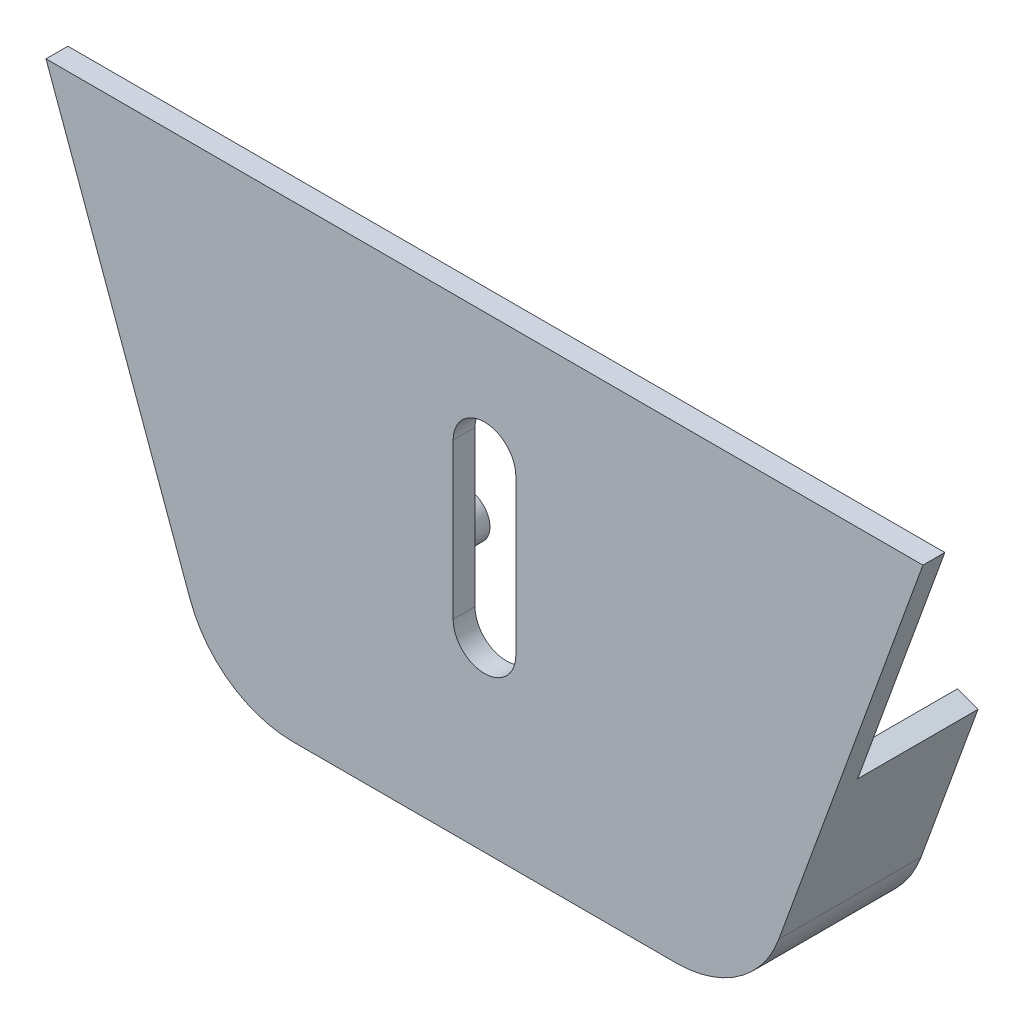
ISO-10303-21;
HEADER;
FILE_DESCRIPTION(('STEP AP214'),'2;1');
FILE_NAME('part.step','',(''),(''),'','','');
FILE_SCHEMA(('AUTOMOTIVE_DESIGN { 1 0 10303 214 1 1 1 1 }'));
ENDSEC;
DATA;
#1=APPLICATION_CONTEXT('core data for automotive mechanical design processes');
#2=APPLICATION_PROTOCOL_DEFINITION('international standard','automotive_design',2000,#1);
#3=PRODUCT_CONTEXT('',#1,'mechanical');
#4=PRODUCT('Part','Part','',(#3));
#5=PRODUCT_RELATED_PRODUCT_CATEGORY('part','',(#4));
#6=PRODUCT_DEFINITION_FORMATION('','',#4);
#7=PRODUCT_DEFINITION_CONTEXT('part definition',#1,'design');
#8=PRODUCT_DEFINITION('design','',#6,#7);
#9=PRODUCT_DEFINITION_SHAPE('','',#8);
#10=(LENGTH_UNIT() NAMED_UNIT(*) SI_UNIT(.MILLI.,.METRE.));
#11=(NAMED_UNIT(*) PLANE_ANGLE_UNIT() SI_UNIT($,.RADIAN.));
#12=(NAMED_UNIT(*) SI_UNIT($,.STERADIAN.) SOLID_ANGLE_UNIT());
#13=UNCERTAINTY_MEASURE_WITH_UNIT(LENGTH_MEASURE(1.E-05),#10,'distance_accuracy_value','');
#14=(GEOMETRIC_REPRESENTATION_CONTEXT(3) GLOBAL_UNCERTAINTY_ASSIGNED_CONTEXT((#13)) GLOBAL_UNIT_ASSIGNED_CONTEXT((#10,
#11,#12)) REPRESENTATION_CONTEXT('',''));
#15=CARTESIAN_POINT('',(0.,0.,0.));
#16=DIRECTION('',(0.,0.,1.));
#17=DIRECTION('',(1.,0.,0.));
#18=AXIS2_PLACEMENT_3D('',#15,#16,#17);
#19=CARTESIAN_POINT('',(-17.5,0.,0.));
#20=DIRECTION('',(0.,0.,1.));
#21=DIRECTION('',(1.,0.,0.));
#22=AXIS2_PLACEMENT_3D('',#19,#20,#21);
#23=PLANE('',#22);
#24=CARTESIAN_POINT('',(17.5,0.,0.));
#25=DIRECTION('',(0.,0.,1.));
#26=DIRECTION('',(1.,0.,0.));
#27=AXIS2_PLACEMENT_3D('',#24,#25,#26);
#28=CIRCLE('',#27,3.5);
#29=CARTESIAN_POINT('',(21.,0.,0.));
#30=VERTEX_POINT('',#29);
#31=EDGE_CURVE('E347',#30,#30,#28,.T.);
#32=ORIENTED_EDGE('',*,*,#31,.T.);
#33=EDGE_LOOP('',(#32));
#34=FACE_BOUND('',#33,.T.);
#35=CARTESIAN_POINT('',(-17.5,0.,0.));
#36=DIRECTION('',(0.,0.,1.));
#37=DIRECTION('',(1.,0.,0.));
#38=AXIS2_PLACEMENT_3D('',#35,#36,#37);
#39=CIRCLE('',#38,3.5);
#40=CARTESIAN_POINT('',(-14.,0.,0.));
#41=VERTEX_POINT('',#40);
#42=EDGE_CURVE('E351',#41,#41,#39,.T.);
#43=ORIENTED_EDGE('',*,*,#42,.T.);
#44=EDGE_LOOP('',(#43));
#45=FACE_BOUND('',#44,.T.);
#46=CARTESIAN_POINT('',(0.,21.1909496420136,0.));
#47=DIRECTION('',(0.,0.,1.));
#48=DIRECTION('',(1.,0.,0.));
#49=AXIS2_PLACEMENT_3D('',#46,#47,#48);
#50=CIRCLE('',#49,2.86348055453857);
#51=CARTESIAN_POINT('',(2.86348055453857,21.1909496420136,0.));
#52=VERTEX_POINT('',#51);
#53=CARTESIAN_POINT('',(-2.86348055453857,21.1909496420136,0.));
#54=VERTEX_POINT('',#53);
#55=EDGE_CURVE('E359',#52,#54,#50,.T.);
#56=ORIENTED_EDGE('',*,*,#55,.T.);
#57=DIRECTION('',(0.,-1.,0.));
#58=VECTOR('',#57,1.);
#59=CARTESIAN_POINT('',(-2.86348055453857,21.1909496420136,0.));
#60=LINE('',#59,#58);
#61=CARTESIAN_POINT('',(-2.86348055453857,7.01437378183931,0.));
#62=VERTEX_POINT('',#61);
#63=EDGE_CURVE('E380',#54,#62,#60,.T.);
#64=ORIENTED_EDGE('',*,*,#63,.T.);
#65=CARTESIAN_POINT('',(0.,7.01437378183931,0.));
#66=DIRECTION('',(0.,0.,1.));
#67=DIRECTION('',(1.,0.,0.));
#68=AXIS2_PLACEMENT_3D('',#65,#66,#67);
#69=CIRCLE('',#68,2.86348055453857);
#70=CARTESIAN_POINT('',(2.86348055453857,7.01437378183931,0.));
#71=VERTEX_POINT('',#70);
#72=EDGE_CURVE('E384',#62,#71,#69,.T.);
#73=ORIENTED_EDGE('',*,*,#72,.T.);
#74=DIRECTION('',(0.,1.,0.));
#75=VECTOR('',#74,1.);
#76=CARTESIAN_POINT('',(2.86348055453857,21.1909496420136,0.));
#77=LINE('',#76,#75);
#78=EDGE_CURVE('E367',#71,#52,#77,.T.);
#79=ORIENTED_EDGE('',*,*,#78,.T.);
#80=EDGE_LOOP('',(#56,#64,#73,#79));
#81=FACE_BOUND('',#80,.T.);
#82=DIRECTION('',(0.939692620785908,0.34202014332567,0.));
#83=VECTOR('',#82,1.);
#84=CARTESIAN_POINT('',(-30.2164350704281,11.5476830106572,0.));
#85=LINE('',#84,#83);
#86=CARTESIAN_POINT('',(-32.0958203119999,10.8636427240058,0.));
#87=VERTEX_POINT('',#86);
#88=CARTESIAN_POINT('',(-30.2164350704281,11.5476830106572,0.));
#89=VERTEX_POINT('',#88);
#90=EDGE_CURVE('E322',#87,#89,#85,.T.);
#91=ORIENTED_EDGE('',*,*,#90,.F.);
#92=DIRECTION('',(0.342020143325671,-0.939692620785908,0.));
#93=VECTOR('',#92,1.);
#94=CARTESIAN_POINT('',(-26.8969262078591,-3.42020143325671,0.));
#95=LINE('',#94,#93);
#96=CARTESIAN_POINT('',(-40.0654484737313,32.7600161398124,0.));
#97=VERTEX_POINT('',#96);
#98=EDGE_CURVE('E229',#97,#87,#95,.T.);
#99=ORIENTED_EDGE('',*,*,#98,.F.);
#100=DIRECTION('',(-1.,0.,0.));
#101=VECTOR('',#100,1.);
#102=CARTESIAN_POINT('',(-40.0654484737313,32.7600161398124,0.));
#103=LINE('',#102,#101);
#104=CARTESIAN_POINT('',(40.0654484737315,32.7600161398124,0.));
#105=VERTEX_POINT('',#104);
#106=EDGE_CURVE('E233',#105,#97,#103,.T.);
#107=ORIENTED_EDGE('',*,*,#106,.F.);
#108=DIRECTION('',(0.342020143325674,0.939692620785906,0.));
#109=VECTOR('',#108,1.);
#110=CARTESIAN_POINT('',(40.0654484737315,32.7600161398124,0.));
#111=LINE('',#110,#109);
#112=CARTESIAN_POINT('',(32.0958203119999,10.8636427240058,0.));
#113=VERTEX_POINT('',#112);
#114=EDGE_CURVE('E211',#113,#105,#111,.T.);
#115=ORIENTED_EDGE('',*,*,#114,.F.);
#116=DIRECTION('',(0.939692620785905,-0.342020143325677,0.));
#117=VECTOR('',#116,1.);
#118=CARTESIAN_POINT('',(32.0958203119999,10.8636427240058,0.));
#119=LINE('',#118,#117);
#120=CARTESIAN_POINT('',(30.2164350704281,11.5476830106572,0.));
#121=VERTEX_POINT('',#120);
#122=EDGE_CURVE('E303',#121,#113,#119,.T.);
#123=ORIENTED_EDGE('',*,*,#122,.F.);
#124=DIRECTION('',(0.342020143325674,0.939692620785907,0.));
#125=VECTOR('',#124,1.);
#126=CARTESIAN_POINT('',(25.0175409662873,-2.73616114660539,0.));
#127=LINE('',#126,#125);
#128=CARTESIAN_POINT('',(25.0175409662873,-2.73616114660539,0.));
#129=VERTEX_POINT('',#128);
#130=EDGE_CURVE('E325',#129,#121,#127,.T.);
#131=ORIENTED_EDGE('',*,*,#130,.F.);
#132=CARTESIAN_POINT('',(17.5,0.,0.));
#133=DIRECTION('',(0.,0.,1.));
#134=DIRECTION('',(-1.,0.,0.));
#135=AXIS2_PLACEMENT_3D('',#132,#133,#134);
#136=CIRCLE('',#135,8.);
#137=CARTESIAN_POINT('',(17.5,-8.,0.));
#138=VERTEX_POINT('',#137);
#139=EDGE_CURVE('E321',#138,#129,#136,.T.);
#140=ORIENTED_EDGE('',*,*,#139,.F.);
#141=DIRECTION('',(0.,1.,0.));
#142=VECTOR('',#141,1.);
#143=CARTESIAN_POINT('',(17.5,-10.,0.));
#144=LINE('',#143,#142);
#145=CARTESIAN_POINT('',(17.5,-10.,0.));
#146=VERTEX_POINT('',#145);
#147=EDGE_CURVE('E206',#146,#138,#144,.T.);
#148=ORIENTED_EDGE('',*,*,#147,.F.);
#149=DIRECTION('',(1.,0.,0.));
#150=VECTOR('',#149,1.);
#151=CARTESIAN_POINT('',(-17.5,-10.,0.));
#152=LINE('',#151,#150);
#153=CARTESIAN_POINT('',(-17.5,-10.,0.));
#154=VERTEX_POINT('',#153);
#155=EDGE_CURVE('E203',#154,#146,#152,.T.);
#156=ORIENTED_EDGE('',*,*,#155,.F.);
#157=DIRECTION('',(0.,-1.,0.));
#158=VECTOR('',#157,1.);
#159=CARTESIAN_POINT('',(-17.5,-7.99999999999998,0.));
#160=LINE('',#159,#158);
#161=CARTESIAN_POINT('',(-17.5,-7.99999999999998,0.));
#162=VERTEX_POINT('',#161);
#163=EDGE_CURVE('E179',#162,#154,#160,.T.);
#164=ORIENTED_EDGE('',*,*,#163,.F.);
#165=CARTESIAN_POINT('',(-17.5,0.,0.));
#166=DIRECTION('',(0.,0.,1.));
#167=DIRECTION('',(-1.,0.,0.));
#168=AXIS2_PLACEMENT_3D('',#165,#166,#167);
#169=CIRCLE('',#168,8.00000000000005);
#170=CARTESIAN_POINT('',(-25.0175409662873,-2.73616114660536,0.));
#171=VERTEX_POINT('',#170);
#172=EDGE_CURVE('E191',#171,#162,#169,.T.);
#173=ORIENTED_EDGE('',*,*,#172,.F.);
#174=DIRECTION('',(0.342020143325669,-0.939692620785908,0.));
#175=VECTOR('',#174,1.);
#176=CARTESIAN_POINT('',(-30.2164350704281,11.5476830106572,0.));
#177=LINE('',#176,#175);
#178=EDGE_CURVE('E738',#89,#171,#177,.T.);
#179=ORIENTED_EDGE('',*,*,#178,.F.);
#180=EDGE_LOOP('',(#91,#99,#107,#115,#123,#131,#140,#148,#156,#164,#173,#179));
#181=FACE_BOUND('',#180,.T.);
#182=ADVANCED_FACE('F45',(#34,#45,#81,#181),#23,.F.);
#183=CARTESIAN_POINT('',(-17.5,0.,2.));
#184=DIRECTION('',(0.,0.,1.));
#185=DIRECTION('',(1.,0.,0.));
#186=AXIS2_PLACEMENT_3D('',#183,#184,#185);
#187=PLANE('',#186);
#188=CARTESIAN_POINT('',(-17.5,0.,2.));
#189=DIRECTION('',(0.,0.,1.));
#190=DIRECTION('',(1.,0.,0.));
#191=AXIS2_PLACEMENT_3D('',#188,#189,#190);
#192=CIRCLE('',#191,10.0000000000001);
#193=CARTESIAN_POINT('',(-26.8969262078591,-3.42020143325671,2.));
#194=VERTEX_POINT('',#193);
#195=CARTESIAN_POINT('',(-17.5,-10.,2.));
#196=VERTEX_POINT('',#195);
#197=EDGE_CURVE('E221',#194,#196,#192,.T.);
#198=ORIENTED_EDGE('',*,*,#197,.T.);
#199=DIRECTION('',(1.,0.,0.));
#200=VECTOR('',#199,1.);
#201=CARTESIAN_POINT('',(-17.5,-10.,2.));
#202=LINE('',#201,#200);
#203=CARTESIAN_POINT('',(17.5,-10.,2.));
#204=VERTEX_POINT('',#203);
#205=EDGE_CURVE('E215',#196,#204,#202,.T.);
#206=ORIENTED_EDGE('',*,*,#205,.T.);
#207=CARTESIAN_POINT('',(17.5,0.,2.));
#208=DIRECTION('',(0.,0.,1.));
#209=DIRECTION('',(1.,0.,0.));
#210=AXIS2_PLACEMENT_3D('',#207,#208,#209);
#211=CIRCLE('',#210,10.);
#212=CARTESIAN_POINT('',(26.8969262078591,-3.42020143325674,2.));
#213=VERTEX_POINT('',#212);
#214=EDGE_CURVE('E220',#204,#213,#211,.T.);
#215=ORIENTED_EDGE('',*,*,#214,.T.);
#216=DIRECTION('',(0.342020143325674,0.939692620785906,0.));
#217=VECTOR('',#216,1.);
#218=CARTESIAN_POINT('',(40.0654484737315,32.7600161398124,2.));
#219=LINE('',#218,#217);
#220=CARTESIAN_POINT('',(40.0654484737315,32.7600161398124,2.));
#221=VERTEX_POINT('',#220);
#222=EDGE_CURVE('E240',#213,#221,#219,.T.);
#223=ORIENTED_EDGE('',*,*,#222,.T.);
#224=DIRECTION('',(-1.,0.,0.));
#225=VECTOR('',#224,1.);
#226=CARTESIAN_POINT('',(-40.0654484737313,32.7600161398124,2.));
#227=LINE('',#226,#225);
#228=CARTESIAN_POINT('',(-40.0654484737313,32.7600161398124,2.));
#229=VERTEX_POINT('',#228);
#230=EDGE_CURVE('E243',#221,#229,#227,.T.);
#231=ORIENTED_EDGE('',*,*,#230,.T.);
#232=DIRECTION('',(0.342020143325671,-0.939692620785908,0.));
#233=VECTOR('',#232,1.);
#234=CARTESIAN_POINT('',(-26.8969262078591,-3.42020143325671,2.));
#235=LINE('',#234,#233);
#236=EDGE_CURVE('E226',#229,#194,#235,.T.);
#237=ORIENTED_EDGE('',*,*,#236,.T.);
#238=EDGE_LOOP('',(#198,#206,#215,#223,#231,#237));
#239=FACE_BOUND('',#238,.T.);
#240=DIRECTION('',(0.,-1.,0.));
#241=VECTOR('',#240,1.);
#242=CARTESIAN_POINT('',(-2.86348055453857,21.1909496420136,2.));
#243=LINE('',#242,#241);
#244=CARTESIAN_POINT('',(-2.86348055453857,21.1909496420136,2.));
#245=VERTEX_POINT('',#244);
#246=CARTESIAN_POINT('',(-2.86348055453857,7.01437378183931,2.));
#247=VERTEX_POINT('',#246);
#248=EDGE_CURVE('E366',#245,#247,#243,.T.);
#249=ORIENTED_EDGE('',*,*,#248,.F.);
#250=CARTESIAN_POINT('',(0.,21.1909496420136,2.));
#251=DIRECTION('',(0.,0.,1.));
#252=DIRECTION('',(1.,0.,0.));
#253=AXIS2_PLACEMENT_3D('',#250,#251,#252);
#254=CIRCLE('',#253,2.86348055453857);
#255=CARTESIAN_POINT('',(2.86348055453857,21.1909496420136,2.));
#256=VERTEX_POINT('',#255);
#257=EDGE_CURVE('E363',#256,#245,#254,.T.);
#258=ORIENTED_EDGE('',*,*,#257,.F.);
#259=DIRECTION('',(0.,1.,0.));
#260=VECTOR('',#259,1.);
#261=CARTESIAN_POINT('',(2.86348055453857,21.1909496420136,2.));
#262=LINE('',#261,#260);
#263=CARTESIAN_POINT('',(2.86348055453857,7.01437378183931,2.));
#264=VERTEX_POINT('',#263);
#265=EDGE_CURVE('E373',#264,#256,#262,.T.);
#266=ORIENTED_EDGE('',*,*,#265,.F.);
#267=CARTESIAN_POINT('',(0.,7.01437378183931,2.));
#268=DIRECTION('',(0.,0.,1.));
#269=DIRECTION('',(1.,0.,0.));
#270=AXIS2_PLACEMENT_3D('',#267,#268,#269);
#271=CIRCLE('',#270,2.86348055453857);
#272=EDGE_CURVE('E370',#247,#264,#271,.T.);
#273=ORIENTED_EDGE('',*,*,#272,.F.);
#274=EDGE_LOOP('',(#249,#258,#266,#273));
#275=FACE_BOUND('',#274,.T.);
#276=ADVANCED_FACE('F223',(#239,#275),#187,.T.);
#277=CARTESIAN_POINT('',(-17.5,0.,2.));
#278=DIRECTION('',(0.,0.,-1.));
#279=DIRECTION('',(-1.,0.,0.));
#280=AXIS2_PLACEMENT_3D('',#277,#278,#279);
#281=CYLINDRICAL_SURFACE('',#280,10.0000000000001);
#282=DIRECTION('',(0.,0.,-1.));
#283=VECTOR('',#282,1.);
#284=CARTESIAN_POINT('',(-26.8969262078591,-3.42020143325671,2.));
#285=LINE('',#284,#283);
#286=CARTESIAN_POINT('',(-26.8969262078591,-3.42020143325671,-11.));
#287=VERTEX_POINT('',#286);
#288=EDGE_CURVE('E247',#194,#287,#285,.T.);
#289=ORIENTED_EDGE('',*,*,#288,.T.);
#290=CARTESIAN_POINT('',(-17.5,0.,-11.));
#291=DIRECTION('',(0.,0.,-1.));
#292=DIRECTION('',(-1.,0.,0.));
#293=AXIS2_PLACEMENT_3D('',#290,#291,#292);
#294=CIRCLE('',#293,10.0000000000001);
#295=CARTESIAN_POINT('',(-17.5,-10.,-11.));
#296=VERTEX_POINT('',#295);
#297=EDGE_CURVE('E192',#296,#287,#294,.T.);
#298=ORIENTED_EDGE('',*,*,#297,.F.);
#299=DIRECTION('',(0.,0.,1.));
#300=VECTOR('',#299,1.);
#301=CARTESIAN_POINT('',(-17.5,-10.,-11.));
#302=LINE('',#301,#300);
#303=EDGE_CURVE('E183',#296,#154,#302,.T.);
#304=ORIENTED_EDGE('',*,*,#303,.T.);
#305=DIRECTION('',(0.,0.,-1.));
#306=VECTOR('',#305,1.);
#307=CARTESIAN_POINT('',(-17.5,-10.,2.));
#308=LINE('',#307,#306);
#309=EDGE_CURVE('E11',#196,#154,#308,.T.);
#310=ORIENTED_EDGE('',*,*,#309,.F.);
#311=ORIENTED_EDGE('',*,*,#197,.F.);
#312=EDGE_LOOP('',(#289,#298,#304,#310,#311));
#313=FACE_BOUND('',#312,.T.);
#314=ADVANCED_FACE('F47',(#313),#281,.T.);
#315=CARTESIAN_POINT('',(-17.5,-10.,2.));
#316=DIRECTION('',(0.,1.,0.));
#317=DIRECTION('',(0.,0.,1.));
#318=AXIS2_PLACEMENT_3D('',#315,#316,#317);
#319=PLANE('',#318);
#320=ORIENTED_EDGE('',*,*,#155,.T.);
#321=DIRECTION('',(0.,0.,-1.));
#322=VECTOR('',#321,1.);
#323=CARTESIAN_POINT('',(17.5,-10.,2.));
#324=LINE('',#323,#322);
#325=EDGE_CURVE('E54',#204,#146,#324,.T.);
#326=ORIENTED_EDGE('',*,*,#325,.F.);
#327=ORIENTED_EDGE('',*,*,#205,.F.);
#328=ORIENTED_EDGE('',*,*,#309,.T.);
#329=EDGE_LOOP('',(#320,#326,#327,#328));
#330=FACE_BOUND('',#329,.T.);
#331=ADVANCED_FACE('F214',(#330),#319,.F.);
#332=CARTESIAN_POINT('',(17.5,0.,2.));
#333=DIRECTION('',(0.,0.,-1.));
#334=DIRECTION('',(-1.,0.,0.));
#335=AXIS2_PLACEMENT_3D('',#332,#333,#334);
#336=CYLINDRICAL_SURFACE('',#335,10.);
#337=ORIENTED_EDGE('',*,*,#325,.T.);
#338=DIRECTION('',(0.,0.,1.));
#339=VECTOR('',#338,1.);
#340=CARTESIAN_POINT('',(17.5,-10.,-11.));
#341=LINE('',#340,#339);
#342=CARTESIAN_POINT('',(17.5,-10.,-11.));
#343=VERTEX_POINT('',#342);
#344=EDGE_CURVE('E270',#343,#146,#341,.T.);
#345=ORIENTED_EDGE('',*,*,#344,.F.);
#346=CARTESIAN_POINT('',(17.5,0.,-11.));
#347=DIRECTION('',(0.,0.,-1.));
#348=DIRECTION('',(-1.,0.,0.));
#349=AXIS2_PLACEMENT_3D('',#346,#347,#348);
#350=CIRCLE('',#349,10.);
#351=CARTESIAN_POINT('',(26.8969262078591,-3.42020143325674,-11.));
#352=VERTEX_POINT('',#351);
#353=EDGE_CURVE('E298',#352,#343,#350,.T.);
#354=ORIENTED_EDGE('',*,*,#353,.F.);
#355=DIRECTION('',(0.,0.,-1.));
#356=VECTOR('',#355,1.);
#357=CARTESIAN_POINT('',(26.8969262078591,-3.42020143325674,2.));
#358=LINE('',#357,#356);
#359=EDGE_CURVE('E263',#213,#352,#358,.T.);
#360=ORIENTED_EDGE('',*,*,#359,.F.);
#361=ORIENTED_EDGE('',*,*,#214,.F.);
#362=EDGE_LOOP('',(#337,#345,#354,#360,#361));
#363=FACE_BOUND('',#362,.T.);
#364=ADVANCED_FACE('F268',(#363),#336,.T.);
#365=CARTESIAN_POINT('',(40.0654484737315,32.7600161398124,2.));
#366=DIRECTION('',(-0.939692620785906,0.342020143325674,0.));
#367=DIRECTION('',(-0.342020143325674,-0.939692620785906,0.));
#368=AXIS2_PLACEMENT_3D('',#365,#366,#367);
#369=PLANE('',#368);
#370=ORIENTED_EDGE('',*,*,#359,.T.);
#371=DIRECTION('',(-0.342020143325674,-0.939692620785907,0.));
#372=VECTOR('',#371,1.);
#373=CARTESIAN_POINT('',(26.8969262078591,-3.42020143325674,-11.));
#374=LINE('',#373,#372);
#375=CARTESIAN_POINT('',(32.0958203119999,10.8636427240058,-11.));
#376=VERTEX_POINT('',#375);
#377=EDGE_CURVE('E315',#376,#352,#374,.T.);
#378=ORIENTED_EDGE('',*,*,#377,.F.);
#379=DIRECTION('',(0.,0.,1.));
#380=VECTOR('',#379,1.);
#381=CARTESIAN_POINT('',(32.0958203119999,10.8636427240058,-11.));
#382=LINE('',#381,#380);
#383=EDGE_CURVE('E61',#376,#113,#382,.T.);
#384=ORIENTED_EDGE('',*,*,#383,.T.);
#385=ORIENTED_EDGE('',*,*,#114,.T.);
#386=DIRECTION('',(0.,0.,-1.));
#387=VECTOR('',#386,1.);
#388=CARTESIAN_POINT('',(40.0654484737315,32.7600161398124,2.));
#389=LINE('',#388,#387);
#390=EDGE_CURVE('E259',#221,#105,#389,.T.);
#391=ORIENTED_EDGE('',*,*,#390,.F.);
#392=ORIENTED_EDGE('',*,*,#222,.F.);
#393=EDGE_LOOP('',(#370,#378,#384,#385,#391,#392));
#394=FACE_BOUND('',#393,.T.);
#395=ADVANCED_FACE('F276',(#394),#369,.F.);
#396=CARTESIAN_POINT('',(-40.0654484737313,32.7600161398124,2.));
#397=DIRECTION('',(0.,-1.,0.));
#398=DIRECTION('',(0.,0.,-1.));
#399=AXIS2_PLACEMENT_3D('',#396,#397,#398);
#400=PLANE('',#399);
#401=ORIENTED_EDGE('',*,*,#106,.T.);
#402=DIRECTION('',(0.,0.,-1.));
#403=VECTOR('',#402,1.);
#404=CARTESIAN_POINT('',(-40.0654484737313,32.7600161398124,2.));
#405=LINE('',#404,#403);
#406=EDGE_CURVE('E255',#229,#97,#405,.T.);
#407=ORIENTED_EDGE('',*,*,#406,.F.);
#408=ORIENTED_EDGE('',*,*,#230,.F.);
#409=ORIENTED_EDGE('',*,*,#390,.T.);
#410=EDGE_LOOP('',(#401,#407,#408,#409));
#411=FACE_BOUND('',#410,.T.);
#412=ADVANCED_FACE('F280',(#411),#400,.F.);
#413=CARTESIAN_POINT('',(-26.8969262078591,-3.42020143325671,2.));
#414=DIRECTION('',(0.939692620785908,0.342020143325671,0.));
#415=DIRECTION('',(-0.342020143325671,0.939692620785908,0.));
#416=AXIS2_PLACEMENT_3D('',#413,#414,#415);
#417=PLANE('',#416);
#418=ORIENTED_EDGE('',*,*,#98,.T.);
#419=DIRECTION('',(0.,0.,1.));
#420=VECTOR('',#419,1.);
#421=CARTESIAN_POINT('',(-32.0958203119999,10.8636427240058,-11.));
#422=LINE('',#421,#420);
#423=CARTESIAN_POINT('',(-32.0958203119999,10.8636427240058,-11.));
#424=VERTEX_POINT('',#423);
#425=EDGE_CURVE('E287',#424,#87,#422,.T.);
#426=ORIENTED_EDGE('',*,*,#425,.F.);
#427=DIRECTION('',(-0.34202014332567,0.939692620785908,0.));
#428=VECTOR('',#427,1.);
#429=CARTESIAN_POINT('',(-32.0958203119999,10.8636427240058,-11.));
#430=LINE('',#429,#428);
#431=EDGE_CURVE('E286',#287,#424,#430,.T.);
#432=ORIENTED_EDGE('',*,*,#431,.F.);
#433=ORIENTED_EDGE('',*,*,#288,.F.);
#434=ORIENTED_EDGE('',*,*,#236,.F.);
#435=ORIENTED_EDGE('',*,*,#406,.T.);
#436=EDGE_LOOP('',(#418,#426,#432,#433,#434,#435));
#437=FACE_BOUND('',#436,.T.);
#438=ADVANCED_FACE('F283',(#437),#417,.F.);
#439=CARTESIAN_POINT('',(0.,21.1909496420136,2.));
#440=DIRECTION('',(0.,0.,-1.));
#441=DIRECTION('',(-1.,0.,0.));
#442=AXIS2_PLACEMENT_3D('',#439,#440,#441);
#443=CYLINDRICAL_SURFACE('',#442,2.86348055453857);
#444=ORIENTED_EDGE('',*,*,#55,.F.);
#445=DIRECTION('',(0.,0.,-1.));
#446=VECTOR('',#445,1.);
#447=CARTESIAN_POINT('',(2.86348055453857,21.1909496420136,2.));
#448=LINE('',#447,#446);
#449=EDGE_CURVE('E376',#256,#52,#448,.T.);
#450=ORIENTED_EDGE('',*,*,#449,.F.);
#451=ORIENTED_EDGE('',*,*,#257,.T.);
#452=DIRECTION('',(0.,0.,-1.));
#453=VECTOR('',#452,1.);
#454=CARTESIAN_POINT('',(-2.86348055453857,21.1909496420136,2.));
#455=LINE('',#454,#453);
#456=EDGE_CURVE('E212',#245,#54,#455,.T.);
#457=ORIENTED_EDGE('',*,*,#456,.T.);
#458=EDGE_LOOP('',(#444,#450,#451,#457));
#459=FACE_BOUND('',#458,.T.);
#460=ADVANCED_FACE('F404',(#459),#443,.F.);
#461=CARTESIAN_POINT('',(-2.86348055453857,21.1909496420136,2.));
#462=DIRECTION('',(1.,0.,0.));
#463=DIRECTION('',(0.,0.,-1.));
#464=AXIS2_PLACEMENT_3D('',#461,#462,#463);
#465=PLANE('',#464);
#466=ORIENTED_EDGE('',*,*,#63,.F.);
#467=ORIENTED_EDGE('',*,*,#456,.F.);
#468=ORIENTED_EDGE('',*,*,#248,.T.);
#469=DIRECTION('',(0.,0.,-1.));
#470=VECTOR('',#469,1.);
#471=CARTESIAN_POINT('',(-2.86348055453857,7.01437378183931,2.));
#472=LINE('',#471,#470);
#473=EDGE_CURVE('E395',#247,#62,#472,.T.);
#474=ORIENTED_EDGE('',*,*,#473,.T.);
#475=EDGE_LOOP('',(#466,#467,#468,#474));
#476=FACE_BOUND('',#475,.T.);
#477=ADVANCED_FACE('F412',(#476),#465,.T.);
#478=CARTESIAN_POINT('',(0.,7.01437378183931,2.));
#479=DIRECTION('',(0.,0.,-1.));
#480=DIRECTION('',(-1.,0.,0.));
#481=AXIS2_PLACEMENT_3D('',#478,#479,#480);
#482=CYLINDRICAL_SURFACE('',#481,2.86348055453857);
#483=ORIENTED_EDGE('',*,*,#72,.F.);
#484=ORIENTED_EDGE('',*,*,#473,.F.);
#485=ORIENTED_EDGE('',*,*,#272,.T.);
#486=DIRECTION('',(0.,0.,-1.));
#487=VECTOR('',#486,1.);
#488=CARTESIAN_POINT('',(2.86348055453857,7.01437378183931,2.));
#489=LINE('',#488,#487);
#490=EDGE_CURVE('E69',#264,#71,#489,.T.);
#491=ORIENTED_EDGE('',*,*,#490,.T.);
#492=EDGE_LOOP('',(#483,#484,#485,#491));
#493=FACE_BOUND('',#492,.T.);
#494=ADVANCED_FACE('F414',(#493),#482,.F.);
#495=CARTESIAN_POINT('',(2.86348055453857,21.1909496420136,2.));
#496=DIRECTION('',(-1.,0.,0.));
#497=DIRECTION('',(0.,0.,1.));
#498=AXIS2_PLACEMENT_3D('',#495,#496,#497);
#499=PLANE('',#498);
#500=ORIENTED_EDGE('',*,*,#78,.F.);
#501=ORIENTED_EDGE('',*,*,#490,.F.);
#502=ORIENTED_EDGE('',*,*,#265,.T.);
#503=ORIENTED_EDGE('',*,*,#449,.T.);
#504=EDGE_LOOP('',(#500,#501,#502,#503));
#505=FACE_BOUND('',#504,.T.);
#506=ADVANCED_FACE('F409',(#505),#499,.T.);
#507=CARTESIAN_POINT('',(-17.5,0.,-4.));
#508=DIRECTION('',(0.,0.,1.));
#509=DIRECTION('',(1.,0.,0.));
#510=AXIS2_PLACEMENT_3D('',#507,#508,#509);
#511=CYLINDRICAL_SURFACE('',#510,3.5);
#512=CARTESIAN_POINT('',(-17.5,0.,-4.));
#513=DIRECTION('',(0.,0.,1.));
#514=DIRECTION('',(1.,0.,0.));
#515=AXIS2_PLACEMENT_3D('',#512,#513,#514);
#516=CIRCLE('',#515,3.5);
#517=CARTESIAN_POINT('',(-14.,0.,-4.));
#518=VERTEX_POINT('',#517);
#519=EDGE_CURVE('E355',#518,#518,#516,.T.);
#520=ORIENTED_EDGE('',*,*,#519,.T.);
#521=EDGE_LOOP('',(#520));
#522=FACE_BOUND('',#521,.T.);
#523=ORIENTED_EDGE('',*,*,#42,.F.);
#524=EDGE_LOOP('',(#523));
#525=FACE_BOUND('',#524,.T.);
#526=ADVANCED_FACE('F421',(#522,#525),#511,.T.);
#527=CARTESIAN_POINT('',(-17.5,0.,-4.));
#528=DIRECTION('',(0.,0.,1.));
#529=DIRECTION('',(1.,0.,0.));
#530=AXIS2_PLACEMENT_3D('',#527,#528,#529);
#531=PLANE('',#530);
#532=CARTESIAN_POINT('',(-17.5,0.,-4.));
#533=DIRECTION('',(0.,0.,1.));
#534=DIRECTION('',(1.,0.,0.));
#535=AXIS2_PLACEMENT_3D('',#532,#533,#534);
#536=CIRCLE('',#535,2.);
#537=CARTESIAN_POINT('',(-15.5,0.,-4.));
#538=VERTEX_POINT('',#537);
#539=EDGE_CURVE('E713',#538,#538,#536,.T.);
#540=ORIENTED_EDGE('',*,*,#539,.T.);
#541=EDGE_LOOP('',(#540));
#542=FACE_BOUND('',#541,.T.);
#543=ORIENTED_EDGE('',*,*,#519,.F.);
#544=EDGE_LOOP('',(#543));
#545=FACE_BOUND('',#544,.T.);
#546=ADVANCED_FACE('F638',(#542,#545),#531,.F.);
#547=CARTESIAN_POINT('',(17.5,0.,-4.));
#548=DIRECTION('',(0.,0.,1.));
#549=DIRECTION('',(1.,0.,0.));
#550=AXIS2_PLACEMENT_3D('',#547,#548,#549);
#551=CYLINDRICAL_SURFACE('',#550,3.5);
#552=CARTESIAN_POINT('',(17.5,0.,-4.));
#553=DIRECTION('',(0.,0.,1.));
#554=DIRECTION('',(1.,0.,0.));
#555=AXIS2_PLACEMENT_3D('',#552,#553,#554);
#556=CIRCLE('',#555,3.5);
#557=CARTESIAN_POINT('',(21.,0.,-4.));
#558=VERTEX_POINT('',#557);
#559=EDGE_CURVE('E346',#558,#558,#556,.T.);
#560=ORIENTED_EDGE('',*,*,#559,.T.);
#561=EDGE_LOOP('',(#560));
#562=FACE_BOUND('',#561,.T.);
#563=ORIENTED_EDGE('',*,*,#31,.F.);
#564=EDGE_LOOP('',(#563));
#565=FACE_BOUND('',#564,.T.);
#566=ADVANCED_FACE('F635',(#562,#565),#551,.T.);
#567=CARTESIAN_POINT('',(17.5,0.,-4.));
#568=DIRECTION('',(0.,0.,1.));
#569=DIRECTION('',(1.,0.,0.));
#570=AXIS2_PLACEMENT_3D('',#567,#568,#569);
#571=PLANE('',#570);
#572=CARTESIAN_POINT('',(17.5,0.,-4.));
#573=DIRECTION('',(0.,0.,1.));
#574=DIRECTION('',(1.,0.,0.));
#575=AXIS2_PLACEMENT_3D('',#572,#573,#574);
#576=CIRCLE('',#575,2.);
#577=CARTESIAN_POINT('',(19.5,0.,-4.));
#578=VERTEX_POINT('',#577);
#579=EDGE_CURVE('E723',#578,#578,#576,.T.);
#580=ORIENTED_EDGE('',*,*,#579,.T.);
#581=EDGE_LOOP('',(#580));
#582=FACE_BOUND('',#581,.T.);
#583=ORIENTED_EDGE('',*,*,#559,.F.);
#584=EDGE_LOOP('',(#583));
#585=FACE_BOUND('',#584,.T.);
#586=ADVANCED_FACE('F493',(#582,#585),#571,.F.);
#587=CARTESIAN_POINT('',(17.5,-10.,-11.));
#588=DIRECTION('',(1.,0.,0.));
#589=DIRECTION('',(0.,0.,-1.));
#590=AXIS2_PLACEMENT_3D('',#587,#588,#589);
#591=PLANE('',#590);
#592=ORIENTED_EDGE('',*,*,#147,.T.);
#593=DIRECTION('',(0.,0.,1.));
#594=VECTOR('',#593,1.);
#595=CARTESIAN_POINT('',(17.5,-8.,-11.));
#596=LINE('',#595,#594);
#597=CARTESIAN_POINT('',(17.5,-8.,-11.));
#598=VERTEX_POINT('',#597);
#599=EDGE_CURVE('E340',#598,#138,#596,.T.);
#600=ORIENTED_EDGE('',*,*,#599,.F.);
#601=DIRECTION('',(0.,1.,0.));
#602=VECTOR('',#601,1.);
#603=CARTESIAN_POINT('',(17.5,-10.,-11.));
#604=LINE('',#603,#602);
#605=EDGE_CURVE('E302',#343,#598,#604,.T.);
#606=ORIENTED_EDGE('',*,*,#605,.F.);
#607=ORIENTED_EDGE('',*,*,#344,.T.);
#608=EDGE_LOOP('',(#592,#600,#606,#607));
#609=FACE_BOUND('',#608,.T.);
#610=ADVANCED_FACE('F487',(#609),#591,.F.);
#611=CARTESIAN_POINT('',(17.5,0.,-11.));
#612=DIRECTION('',(0.,0.,1.));
#613=DIRECTION('',(1.,0.,0.));
#614=AXIS2_PLACEMENT_3D('',#611,#612,#613);
#615=CYLINDRICAL_SURFACE('',#614,8.);
#616=ORIENTED_EDGE('',*,*,#139,.T.);
#617=DIRECTION('',(0.,0.,1.));
#618=VECTOR('',#617,1.);
#619=CARTESIAN_POINT('',(25.0175409662873,-2.73616114660539,-11.));
#620=LINE('',#619,#618);
#621=CARTESIAN_POINT('',(25.0175409662873,-2.73616114660539,-11.));
#622=VERTEX_POINT('',#621);
#623=EDGE_CURVE('E336',#622,#129,#620,.T.);
#624=ORIENTED_EDGE('',*,*,#623,.F.);
#625=CARTESIAN_POINT('',(17.5,0.,-11.));
#626=DIRECTION('',(0.,0.,1.));
#627=DIRECTION('',(-1.,0.,0.));
#628=AXIS2_PLACEMENT_3D('',#625,#626,#627);
#629=CIRCLE('',#628,8.);
#630=EDGE_CURVE('E306',#598,#622,#629,.T.);
#631=ORIENTED_EDGE('',*,*,#630,.F.);
#632=ORIENTED_EDGE('',*,*,#599,.T.);
#633=EDGE_LOOP('',(#616,#624,#631,#632));
#634=FACE_BOUND('',#633,.T.);
#635=ADVANCED_FACE('F492',(#634),#615,.F.);
#636=CARTESIAN_POINT('',(25.0175409662873,-2.73616114660539,-11.));
#637=DIRECTION('',(0.939692620785907,-0.342020143325674,0.));
#638=DIRECTION('',(0.342020143325674,0.939692620785907,0.));
#639=AXIS2_PLACEMENT_3D('',#636,#637,#638);
#640=PLANE('',#639);
#641=ORIENTED_EDGE('',*,*,#130,.T.);
#642=DIRECTION('',(0.,0.,1.));
#643=VECTOR('',#642,1.);
#644=CARTESIAN_POINT('',(30.2164350704281,11.5476830106572,-11.));
#645=LINE('',#644,#643);
#646=CARTESIAN_POINT('',(30.2164350704281,11.5476830106572,-11.));
#647=VERTEX_POINT('',#646);
#648=EDGE_CURVE('E332',#647,#121,#645,.T.);
#649=ORIENTED_EDGE('',*,*,#648,.F.);
#650=DIRECTION('',(0.342020143325674,0.939692620785907,0.));
#651=VECTOR('',#650,1.);
#652=CARTESIAN_POINT('',(25.0175409662873,-2.73616114660539,-11.));
#653=LINE('',#652,#651);
#654=EDGE_CURVE('E309',#622,#647,#653,.T.);
#655=ORIENTED_EDGE('',*,*,#654,.F.);
#656=ORIENTED_EDGE('',*,*,#623,.T.);
#657=EDGE_LOOP('',(#641,#649,#655,#656));
#658=FACE_BOUND('',#657,.T.);
#659=ADVANCED_FACE('F503',(#658),#640,.F.);
#660=CARTESIAN_POINT('',(32.0958203119999,10.8636427240058,-11.));
#661=DIRECTION('',(-0.342020143325677,-0.939692620785905,0.));
#662=DIRECTION('',(0.939692620785905,-0.342020143325677,0.));
#663=AXIS2_PLACEMENT_3D('',#660,#661,#662);
#664=PLANE('',#663);
#665=ORIENTED_EDGE('',*,*,#122,.T.);
#666=ORIENTED_EDGE('',*,*,#383,.F.);
#667=DIRECTION('',(0.939692620785905,-0.342020143325677,0.));
#668=VECTOR('',#667,1.);
#669=CARTESIAN_POINT('',(32.0958203119999,10.8636427240058,-11.));
#670=LINE('',#669,#668);
#671=EDGE_CURVE('E312',#647,#376,#670,.T.);
#672=ORIENTED_EDGE('',*,*,#671,.F.);
#673=ORIENTED_EDGE('',*,*,#648,.T.);
#674=EDGE_LOOP('',(#665,#666,#672,#673));
#675=FACE_BOUND('',#674,.T.);
#676=ADVANCED_FACE('F513',(#675),#664,.F.);
#677=CARTESIAN_POINT('',(17.5,0.,-11.));
#678=DIRECTION('',(0.,0.,-1.));
#679=DIRECTION('',(-1.,0.,0.));
#680=AXIS2_PLACEMENT_3D('',#677,#678,#679);
#681=PLANE('',#680);
#682=ORIENTED_EDGE('',*,*,#353,.T.);
#683=ORIENTED_EDGE('',*,*,#605,.T.);
#684=ORIENTED_EDGE('',*,*,#630,.T.);
#685=ORIENTED_EDGE('',*,*,#654,.T.);
#686=ORIENTED_EDGE('',*,*,#671,.T.);
#687=ORIENTED_EDGE('',*,*,#377,.T.);
#688=EDGE_LOOP('',(#682,#683,#684,#685,#686,#687));
#689=FACE_BOUND('',#688,.T.);
#690=ADVANCED_FACE('F523',(#689),#681,.T.);
#691=CARTESIAN_POINT('',(-30.2164350704281,11.5476830106572,-11.));
#692=DIRECTION('',(0.34202014332567,-0.939692620785908,0.));
#693=DIRECTION('',(0.939692620785908,0.34202014332567,0.));
#694=AXIS2_PLACEMENT_3D('',#691,#692,#693);
#695=PLANE('',#694);
#696=ORIENTED_EDGE('',*,*,#90,.T.);
#697=DIRECTION('',(0.,0.,1.));
#698=VECTOR('',#697,1.);
#699=CARTESIAN_POINT('',(-30.2164350704281,11.5476830106572,-11.));
#700=LINE('',#699,#698);
#701=CARTESIAN_POINT('',(-30.2164350704281,11.5476830106572,-11.));
#702=VERTEX_POINT('',#701);
#703=EDGE_CURVE('E720',#702,#89,#700,.T.);
#704=ORIENTED_EDGE('',*,*,#703,.F.);
#705=DIRECTION('',(0.939692620785908,0.34202014332567,0.));
#706=VECTOR('',#705,1.);
#707=CARTESIAN_POINT('',(-30.2164350704281,11.5476830106572,-11.));
#708=LINE('',#707,#706);
#709=EDGE_CURVE('E291',#424,#702,#708,.T.);
#710=ORIENTED_EDGE('',*,*,#709,.F.);
#711=ORIENTED_EDGE('',*,*,#425,.T.);
#712=EDGE_LOOP('',(#696,#704,#710,#711));
#713=FACE_BOUND('',#712,.T.);
#714=ADVANCED_FACE('F533',(#713),#695,.F.);
#715=CARTESIAN_POINT('',(-30.2164350704281,11.5476830106572,-11.));
#716=DIRECTION('',(-0.939692620785908,-0.342020143325669,0.));
#717=DIRECTION('',(0.342020143325669,-0.939692620785908,0.));
#718=AXIS2_PLACEMENT_3D('',#715,#716,#717);
#719=PLANE('',#718);
#720=ORIENTED_EDGE('',*,*,#178,.T.);
#721=DIRECTION('',(0.,0.,1.));
#722=VECTOR('',#721,1.);
#723=CARTESIAN_POINT('',(-25.0175409662873,-2.73616114660536,-11.));
#724=LINE('',#723,#722);
#725=CARTESIAN_POINT('',(-25.0175409662873,-2.73616114660536,-11.));
#726=VERTEX_POINT('',#725);
#727=EDGE_CURVE('E730',#726,#171,#724,.T.);
#728=ORIENTED_EDGE('',*,*,#727,.F.);
#729=DIRECTION('',(0.342020143325669,-0.939692620785908,0.));
#730=VECTOR('',#729,1.);
#731=CARTESIAN_POINT('',(-30.2164350704281,11.5476830106572,-11.));
#732=LINE('',#731,#730);
#733=EDGE_CURVE('E748',#702,#726,#732,.T.);
#734=ORIENTED_EDGE('',*,*,#733,.F.);
#735=ORIENTED_EDGE('',*,*,#703,.T.);
#736=EDGE_LOOP('',(#720,#728,#734,#735));
#737=FACE_BOUND('',#736,.T.);
#738=ADVANCED_FACE('F543',(#737),#719,.F.);
#739=CARTESIAN_POINT('',(-17.5,0.,-11.));
#740=DIRECTION('',(0.,0.,1.));
#741=DIRECTION('',(1.,0.,0.));
#742=AXIS2_PLACEMENT_3D('',#739,#740,#741);
#743=CYLINDRICAL_SURFACE('',#742,8.00000000000005);
#744=ORIENTED_EDGE('',*,*,#172,.T.);
#745=DIRECTION('',(0.,0.,1.));
#746=VECTOR('',#745,1.);
#747=CARTESIAN_POINT('',(-17.5,-7.99999999999998,-11.));
#748=LINE('',#747,#746);
#749=CARTESIAN_POINT('',(-17.5,-7.99999999999998,-11.));
#750=VERTEX_POINT('',#749);
#751=EDGE_CURVE('E186',#750,#162,#748,.T.);
#752=ORIENTED_EDGE('',*,*,#751,.F.);
#753=CARTESIAN_POINT('',(-17.5,0.,-11.));
#754=DIRECTION('',(0.,0.,1.));
#755=DIRECTION('',(-1.,0.,0.));
#756=AXIS2_PLACEMENT_3D('',#753,#754,#755);
#757=CIRCLE('',#756,8.00000000000005);
#758=EDGE_CURVE('E745',#726,#750,#757,.T.);
#759=ORIENTED_EDGE('',*,*,#758,.F.);
#760=ORIENTED_EDGE('',*,*,#727,.T.);
#761=EDGE_LOOP('',(#744,#752,#759,#760));
#762=FACE_BOUND('',#761,.T.);
#763=ADVANCED_FACE('F553',(#762),#743,.F.);
#764=CARTESIAN_POINT('',(-17.5,-7.99999999999998,-11.));
#765=DIRECTION('',(-1.,0.,0.));
#766=DIRECTION('',(0.,0.,1.));
#767=AXIS2_PLACEMENT_3D('',#764,#765,#766);
#768=PLANE('',#767);
#769=ORIENTED_EDGE('',*,*,#163,.T.);
#770=ORIENTED_EDGE('',*,*,#303,.F.);
#771=DIRECTION('',(0.,-1.,0.));
#772=VECTOR('',#771,1.);
#773=CARTESIAN_POINT('',(-17.5,-7.99999999999998,-11.));
#774=LINE('',#773,#772);
#775=EDGE_CURVE('E199',#750,#296,#774,.T.);
#776=ORIENTED_EDGE('',*,*,#775,.F.);
#777=ORIENTED_EDGE('',*,*,#751,.T.);
#778=EDGE_LOOP('',(#769,#770,#776,#777));
#779=FACE_BOUND('',#778,.T.);
#780=ADVANCED_FACE('F181',(#779),#768,.F.);
#781=CARTESIAN_POINT('',(-17.5,0.,-11.));
#782=DIRECTION('',(0.,0.,-1.));
#783=DIRECTION('',(-1.,0.,0.));
#784=AXIS2_PLACEMENT_3D('',#781,#782,#783);
#785=PLANE('',#784);
#786=ORIENTED_EDGE('',*,*,#297,.T.);
#787=ORIENTED_EDGE('',*,*,#431,.T.);
#788=ORIENTED_EDGE('',*,*,#709,.T.);
#789=ORIENTED_EDGE('',*,*,#733,.T.);
#790=ORIENTED_EDGE('',*,*,#758,.T.);
#791=ORIENTED_EDGE('',*,*,#775,.T.);
#792=EDGE_LOOP('',(#786,#787,#788,#789,#790,#791));
#793=FACE_BOUND('',#792,.T.);
#794=ADVANCED_FACE('F293',(#793),#785,.T.);
#795=CARTESIAN_POINT('',(-17.5,0.,-14.));
#796=DIRECTION('',(0.,0.,1.));
#797=DIRECTION('',(1.,0.,0.));
#798=AXIS2_PLACEMENT_3D('',#795,#796,#797);
#799=PLANE('',#798);
#800=CARTESIAN_POINT('',(-17.5,0.,-14.));
#801=DIRECTION('',(0.,0.,1.));
#802=DIRECTION('',(1.,0.,0.));
#803=AXIS2_PLACEMENT_3D('',#800,#801,#802);
#804=CIRCLE('',#803,2.);
#805=CARTESIAN_POINT('',(-15.5,0.,-14.));
#806=VERTEX_POINT('',#805);
#807=EDGE_CURVE('E716',#806,#806,#804,.T.);
#808=ORIENTED_EDGE('',*,*,#807,.F.);
#809=EDGE_LOOP('',(#808));
#810=FACE_BOUND('',#809,.T.);
#811=ADVANCED_FACE('F580',(#810),#799,.F.);
#812=CARTESIAN_POINT('',(-17.5,0.,-14.));
#813=DIRECTION('',(0.,0.,1.));
#814=DIRECTION('',(1.,0.,0.));
#815=AXIS2_PLACEMENT_3D('',#812,#813,#814);
#816=CYLINDRICAL_SURFACE('',#815,2.);
#817=ORIENTED_EDGE('',*,*,#807,.T.);
#818=EDGE_LOOP('',(#817));
#819=FACE_BOUND('',#818,.T.);
#820=ORIENTED_EDGE('',*,*,#539,.F.);
#821=EDGE_LOOP('',(#820));
#822=FACE_BOUND('',#821,.T.);
#823=ADVANCED_FACE('F599',(#819,#822),#816,.T.);
#824=CARTESIAN_POINT('',(17.5,0.,-14.));
#825=DIRECTION('',(0.,0.,1.));
#826=DIRECTION('',(1.,0.,0.));
#827=AXIS2_PLACEMENT_3D('',#824,#825,#826);
#828=PLANE('',#827);
#829=CARTESIAN_POINT('',(17.5,0.,-14.));
#830=DIRECTION('',(0.,0.,1.));
#831=DIRECTION('',(1.,0.,0.));
#832=AXIS2_PLACEMENT_3D('',#829,#830,#831);
#833=CIRCLE('',#832,2.);
#834=CARTESIAN_POINT('',(19.5,0.,-14.));
#835=VERTEX_POINT('',#834);
#836=EDGE_CURVE('E767',#835,#835,#833,.T.);
#837=ORIENTED_EDGE('',*,*,#836,.F.);
#838=EDGE_LOOP('',(#837));
#839=FACE_BOUND('',#838,.T.);
#840=ADVANCED_FACE('F609',(#839),#828,.F.);
#841=CARTESIAN_POINT('',(17.5,0.,-14.));
#842=DIRECTION('',(0.,0.,1.));
#843=DIRECTION('',(1.,0.,0.));
#844=AXIS2_PLACEMENT_3D('',#841,#842,#843);
#845=CYLINDRICAL_SURFACE('',#844,2.);
#846=ORIENTED_EDGE('',*,*,#836,.T.);
#847=EDGE_LOOP('',(#846));
#848=FACE_BOUND('',#847,.T.);
#849=ORIENTED_EDGE('',*,*,#579,.F.);
#850=EDGE_LOOP('',(#849));
#851=FACE_BOUND('',#850,.T.);
#852=ADVANCED_FACE('F619',(#848,#851),#845,.T.);
#853=CLOSED_SHELL('',(#182,#276,#314,#331,#364,#395,#412,#438,#460,#477,#494,#506,#526,#546,
#566,#586,#610,#635,#659,#676,#690,#714,#738,#763,#780,#794,#811,#823,#840,#852));
#854=MANIFOLD_SOLID_BREP('B2',#853);
#855=ADVANCED_BREP_SHAPE_REPRESENTATION('',(#18,#854),#14);
#856=SHAPE_DEFINITION_REPRESENTATION(#9,#855);
ENDSEC;
END-ISO-10303-21;
